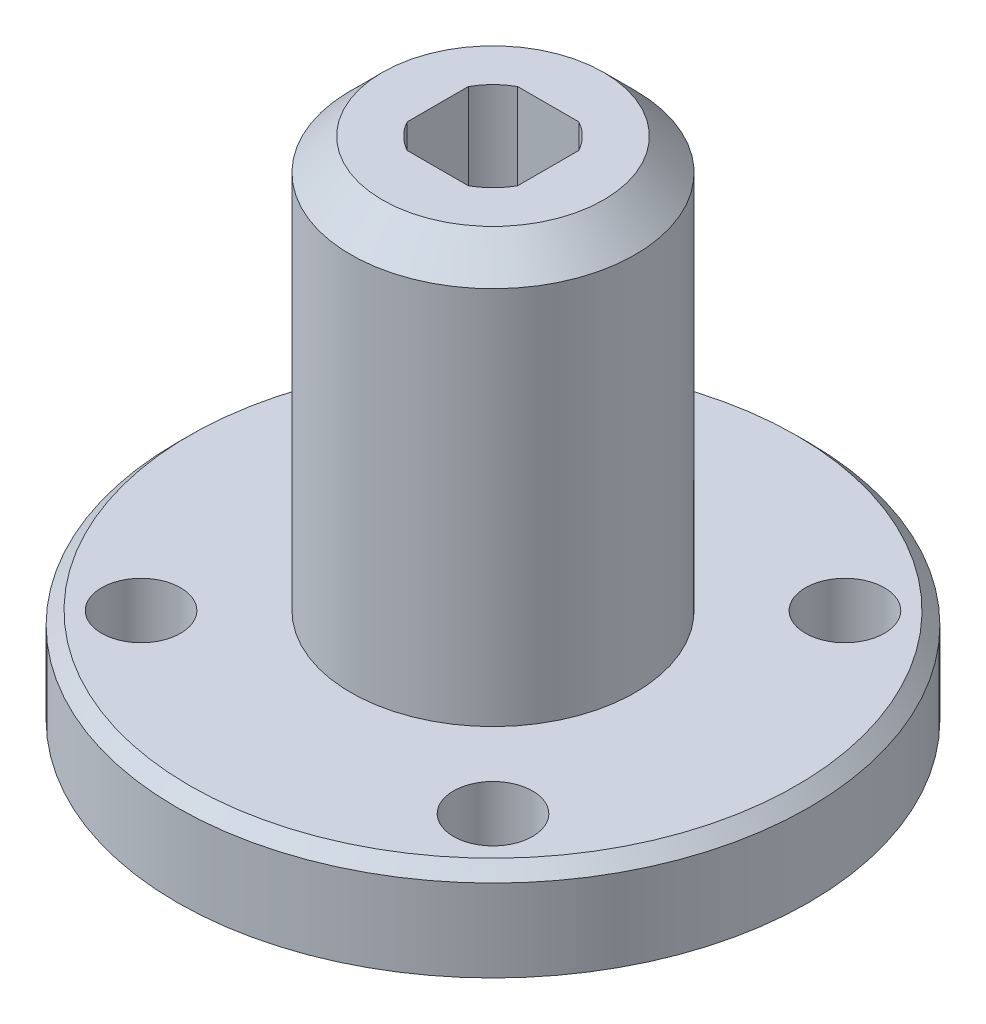
ISO-10303-21;
HEADER;
FILE_DESCRIPTION(('STEP AP214'),'2;1');
FILE_NAME('part.step','',(''),(''),'','','');
FILE_SCHEMA(('AUTOMOTIVE_DESIGN { 1 0 10303 214 1 1 1 1 }'));
ENDSEC;
DATA;
#1=APPLICATION_CONTEXT('core data for automotive mechanical design processes');
#2=APPLICATION_PROTOCOL_DEFINITION('international standard','automotive_design',2000,#1);
#3=PRODUCT_CONTEXT('',#1,'mechanical');
#4=PRODUCT('Part','Part','',(#3));
#5=PRODUCT_RELATED_PRODUCT_CATEGORY('part','',(#4));
#6=PRODUCT_DEFINITION_FORMATION('','',#4);
#7=PRODUCT_DEFINITION_CONTEXT('part definition',#1,'design');
#8=PRODUCT_DEFINITION('design','',#6,#7);
#9=PRODUCT_DEFINITION_SHAPE('','',#8);
#10=(LENGTH_UNIT() NAMED_UNIT(*) SI_UNIT(.MILLI.,.METRE.));
#11=(NAMED_UNIT(*) PLANE_ANGLE_UNIT() SI_UNIT($,.RADIAN.));
#12=(NAMED_UNIT(*) SI_UNIT($,.STERADIAN.) SOLID_ANGLE_UNIT());
#13=UNCERTAINTY_MEASURE_WITH_UNIT(LENGTH_MEASURE(1.E-05),#10,'distance_accuracy_value','');
#14=(GEOMETRIC_REPRESENTATION_CONTEXT(3) GLOBAL_UNCERTAINTY_ASSIGNED_CONTEXT((#13)) GLOBAL_UNIT_ASSIGNED_CONTEXT((#10,
#11,#12)) REPRESENTATION_CONTEXT('',''));
#15=CARTESIAN_POINT('',(0.,0.,0.));
#16=DIRECTION('',(0.,0.,1.));
#17=DIRECTION('',(1.,0.,0.));
#18=AXIS2_PLACEMENT_3D('',#15,#16,#17);
#19=CARTESIAN_POINT('',(0.,6.,0.));
#20=DIRECTION('',(0.,1.,0.));
#21=DIRECTION('',(0.,0.,1.));
#22=AXIS2_PLACEMENT_3D('',#19,#20,#21);
#23=PLANE('',#22);
#24=CARTESIAN_POINT('',(0.,6.,0.));
#25=DIRECTION('',(0.,1.,0.));
#26=DIRECTION('',(0.,0.,1.));
#27=AXIS2_PLACEMENT_3D('',#24,#25,#26);
#28=CIRCLE('',#27,19.2);
#29=CARTESIAN_POINT('',(0.,6.,19.2));
#30=VERTEX_POINT('',#29);
#31=EDGE_CURVE('E192',#30,#30,#28,.T.);
#32=ORIENTED_EDGE('',*,*,#31,.T.);
#33=EDGE_LOOP('',(#32));
#34=FACE_BOUND('',#33,.T.);
#35=CARTESIAN_POINT('',(-11.1369318036877,6.,11.1369318036886));
#36=DIRECTION('',(0.,1.,0.));
#37=DIRECTION('',(0.,0.,1.));
#38=AXIS2_PLACEMENT_3D('',#35,#36,#37);
#39=CIRCLE('',#38,2.5);
#40=CARTESIAN_POINT('',(-11.1369318036877,6.,13.6369318036886));
#41=VERTEX_POINT('',#40);
#42=EDGE_CURVE('E166',#41,#41,#39,.T.);
#43=ORIENTED_EDGE('',*,*,#42,.F.);
#44=EDGE_LOOP('',(#43));
#45=FACE_BOUND('',#44,.T.);
#46=CARTESIAN_POINT('',(11.1369318036885,6.,-11.1369318036886));
#47=DIRECTION('',(0.,1.,0.));
#48=DIRECTION('',(0.,0.,1.));
#49=AXIS2_PLACEMENT_3D('',#46,#47,#48);
#50=CIRCLE('',#49,2.5);
#51=CARTESIAN_POINT('',(11.1369318036885,6.,-8.63693180368857));
#52=VERTEX_POINT('',#51);
#53=EDGE_CURVE('E178',#52,#52,#50,.T.);
#54=ORIENTED_EDGE('',*,*,#53,.F.);
#55=EDGE_LOOP('',(#54));
#56=FACE_BOUND('',#55,.T.);
#57=CARTESIAN_POINT('',(-11.1369318036881,6.,-11.1369318036881));
#58=DIRECTION('',(0.,1.,0.));
#59=DIRECTION('',(0.,0.,1.));
#60=AXIS2_PLACEMENT_3D('',#57,#58,#59);
#61=CIRCLE('',#60,2.5);
#62=CARTESIAN_POINT('',(-11.1369318036881,6.,-8.63693180368811));
#63=VERTEX_POINT('',#62);
#64=EDGE_CURVE('E184',#63,#63,#61,.T.);
#65=ORIENTED_EDGE('',*,*,#64,.F.);
#66=EDGE_LOOP('',(#65));
#67=FACE_BOUND('',#66,.T.);
#68=CARTESIAN_POINT('',(11.136931803689,6.,11.1369318036881));
#69=DIRECTION('',(0.,1.,0.));
#70=DIRECTION('',(0.,0.,1.));
#71=AXIS2_PLACEMENT_3D('',#68,#69,#70);
#72=CIRCLE('',#71,2.5);
#73=CARTESIAN_POINT('',(11.136931803689,6.,13.6369318036881));
#74=VERTEX_POINT('',#73);
#75=EDGE_CURVE('E172',#74,#74,#72,.T.);
#76=ORIENTED_EDGE('',*,*,#75,.F.);
#77=EDGE_LOOP('',(#76));
#78=FACE_BOUND('',#77,.T.);
#79=CARTESIAN_POINT('',(0.,6.,0.));
#80=DIRECTION('',(0.,1.,0.));
#81=DIRECTION('',(0.,0.,1.));
#82=AXIS2_PLACEMENT_3D('',#79,#80,#81);
#83=CIRCLE('',#82,9.);
#84=CARTESIAN_POINT('',(0.,6.,-9.));
#85=VERTEX_POINT('',#84);
#86=EDGE_CURVE('E112',#85,#85,#83,.T.);
#87=ORIENTED_EDGE('',*,*,#86,.F.);
#88=EDGE_LOOP('',(#87));
#89=FACE_BOUND('',#88,.T.);
#90=ADVANCED_FACE('F33',(#34,#45,#56,#67,#78,#89),#23,.T.);
#91=CARTESIAN_POINT('',(0.,0.,0.));
#92=DIRECTION('',(0.,1.,0.));
#93=DIRECTION('',(0.,0.,1.));
#94=AXIS2_PLACEMENT_3D('',#91,#92,#93);
#95=PLANE('',#94);
#96=CARTESIAN_POINT('',(0.,0.,0.));
#97=DIRECTION('',(0.,1.,0.));
#98=DIRECTION('',(0.,0.,1.));
#99=AXIS2_PLACEMENT_3D('',#96,#97,#98);
#100=CIRCLE('',#99,20.);
#101=CARTESIAN_POINT('',(0.,0.,20.));
#102=VERTEX_POINT('',#101);
#103=EDGE_CURVE('E187',#102,#102,#100,.T.);
#104=ORIENTED_EDGE('',*,*,#103,.F.);
#105=EDGE_LOOP('',(#104));
#106=FACE_BOUND('',#105,.T.);
#107=CARTESIAN_POINT('',(-11.1369318036881,0.,-11.1369318036881));
#108=DIRECTION('',(0.,1.,0.));
#109=DIRECTION('',(0.,0.,1.));
#110=AXIS2_PLACEMENT_3D('',#107,#108,#109);
#111=CIRCLE('',#110,2.5);
#112=CARTESIAN_POINT('',(-11.1369318036881,0.,-8.63693180368811));
#113=VERTEX_POINT('',#112);
#114=EDGE_CURVE('E181',#113,#113,#111,.T.);
#115=ORIENTED_EDGE('',*,*,#114,.T.);
#116=EDGE_LOOP('',(#115));
#117=FACE_BOUND('',#116,.T.);
#118=CARTESIAN_POINT('',(11.1369318036885,0.,-11.1369318036886));
#119=DIRECTION('',(0.,1.,0.));
#120=DIRECTION('',(0.,0.,1.));
#121=AXIS2_PLACEMENT_3D('',#118,#119,#120);
#122=CIRCLE('',#121,2.5);
#123=CARTESIAN_POINT('',(11.1369318036885,0.,-8.63693180368857));
#124=VERTEX_POINT('',#123);
#125=EDGE_CURVE('E175',#124,#124,#122,.T.);
#126=ORIENTED_EDGE('',*,*,#125,.T.);
#127=EDGE_LOOP('',(#126));
#128=FACE_BOUND('',#127,.T.);
#129=CARTESIAN_POINT('',(11.136931803689,0.,11.1369318036881));
#130=DIRECTION('',(0.,1.,0.));
#131=DIRECTION('',(0.,0.,1.));
#132=AXIS2_PLACEMENT_3D('',#129,#130,#131);
#133=CIRCLE('',#132,2.5);
#134=CARTESIAN_POINT('',(11.136931803689,0.,13.6369318036881));
#135=VERTEX_POINT('',#134);
#136=EDGE_CURVE('E169',#135,#135,#133,.T.);
#137=ORIENTED_EDGE('',*,*,#136,.T.);
#138=EDGE_LOOP('',(#137));
#139=FACE_BOUND('',#138,.T.);
#140=CARTESIAN_POINT('',(-11.1369318036877,0.,11.1369318036886));
#141=DIRECTION('',(0.,1.,0.));
#142=DIRECTION('',(0.,0.,1.));
#143=AXIS2_PLACEMENT_3D('',#140,#141,#142);
#144=CIRCLE('',#143,2.5);
#145=CARTESIAN_POINT('',(-11.1369318036877,0.,13.6369318036886));
#146=VERTEX_POINT('',#145);
#147=EDGE_CURVE('E165',#146,#146,#144,.T.);
#148=ORIENTED_EDGE('',*,*,#147,.T.);
#149=EDGE_LOOP('',(#148));
#150=FACE_BOUND('',#149,.T.);
#151=ADVANCED_FACE('F211',(#106,#117,#128,#139,#150),#95,.F.);
#152=CARTESIAN_POINT('',(0.,6.,0.));
#153=DIRECTION('',(0.,-1.,0.));
#154=DIRECTION('',(0.,0.,-1.));
#155=AXIS2_PLACEMENT_3D('',#152,#153,#154);
#156=CYLINDRICAL_SURFACE('',#155,20.);
#157=CARTESIAN_POINT('',(0.,5.19999999999999,0.));
#158=DIRECTION('',(0.,1.,0.));
#159=DIRECTION('',(0.,0.,1.));
#160=AXIS2_PLACEMENT_3D('',#157,#158,#159);
#161=CIRCLE('',#160,20.);
#162=CARTESIAN_POINT('',(0.,5.19999999999999,20.));
#163=VERTEX_POINT('',#162);
#164=EDGE_CURVE('E195',#163,#163,#161,.F.);
#165=ORIENTED_EDGE('',*,*,#164,.T.);
#166=EDGE_LOOP('',(#165));
#167=FACE_BOUND('',#166,.T.);
#168=ORIENTED_EDGE('',*,*,#103,.T.);
#169=EDGE_LOOP('',(#168));
#170=FACE_BOUND('',#169,.T.);
#171=ADVANCED_FACE('F217',(#167,#170),#156,.T.);
#172=CARTESIAN_POINT('',(-11.1369318036881,6.,-11.1369318036881));
#173=DIRECTION('',(0.,-1.,0.));
#174=DIRECTION('',(0.,0.,-1.));
#175=AXIS2_PLACEMENT_3D('',#172,#173,#174);
#176=CYLINDRICAL_SURFACE('',#175,2.5);
#177=ORIENTED_EDGE('',*,*,#64,.T.);
#178=EDGE_LOOP('',(#177));
#179=FACE_BOUND('',#178,.T.);
#180=ORIENTED_EDGE('',*,*,#114,.F.);
#181=EDGE_LOOP('',(#180));
#182=FACE_BOUND('',#181,.T.);
#183=ADVANCED_FACE('F273',(#179,#182),#176,.F.);
#184=CARTESIAN_POINT('',(11.1369318036885,6.,-11.1369318036886));
#185=DIRECTION('',(0.,-1.,0.));
#186=DIRECTION('',(0.,0.,-1.));
#187=AXIS2_PLACEMENT_3D('',#184,#185,#186);
#188=CYLINDRICAL_SURFACE('',#187,2.5);
#189=ORIENTED_EDGE('',*,*,#53,.T.);
#190=EDGE_LOOP('',(#189));
#191=FACE_BOUND('',#190,.T.);
#192=ORIENTED_EDGE('',*,*,#125,.F.);
#193=EDGE_LOOP('',(#192));
#194=FACE_BOUND('',#193,.T.);
#195=ADVANCED_FACE('F270',(#191,#194),#188,.F.);
#196=CARTESIAN_POINT('',(11.136931803689,6.,11.1369318036881));
#197=DIRECTION('',(0.,-1.,0.));
#198=DIRECTION('',(0.,0.,-1.));
#199=AXIS2_PLACEMENT_3D('',#196,#197,#198);
#200=CYLINDRICAL_SURFACE('',#199,2.5);
#201=ORIENTED_EDGE('',*,*,#75,.T.);
#202=EDGE_LOOP('',(#201));
#203=FACE_BOUND('',#202,.T.);
#204=ORIENTED_EDGE('',*,*,#136,.F.);
#205=EDGE_LOOP('',(#204));
#206=FACE_BOUND('',#205,.T.);
#207=ADVANCED_FACE('F266',(#203,#206),#200,.F.);
#208=CARTESIAN_POINT('',(-11.1369318036877,6.,11.1369318036886));
#209=DIRECTION('',(0.,-1.,0.));
#210=DIRECTION('',(0.,0.,-1.));
#211=AXIS2_PLACEMENT_3D('',#208,#209,#210);
#212=CYLINDRICAL_SURFACE('',#211,2.5);
#213=ORIENTED_EDGE('',*,*,#42,.T.);
#214=EDGE_LOOP('',(#213));
#215=FACE_BOUND('',#214,.T.);
#216=ORIENTED_EDGE('',*,*,#147,.F.);
#217=EDGE_LOOP('',(#216));
#218=FACE_BOUND('',#217,.T.);
#219=ADVANCED_FACE('F260',(#215,#218),#212,.F.);
#220=CARTESIAN_POINT('',(0.,32.,0.));
#221=DIRECTION('',(0.,1.,0.));
#222=DIRECTION('',(0.,0.,1.));
#223=AXIS2_PLACEMENT_3D('',#220,#221,#222);
#224=PLANE('',#223);
#225=CARTESIAN_POINT('',(0.,32.,0.));
#226=DIRECTION('',(0.,1.,0.));
#227=DIRECTION('',(0.,0.,1.));
#228=AXIS2_PLACEMENT_3D('',#225,#226,#227);
#229=CIRCLE('',#228,7.00000000000003);
#230=CARTESIAN_POINT('',(0.,32.,7.00000000000003));
#231=VERTEX_POINT('',#230);
#232=EDGE_CURVE('E41',#231,#231,#229,.T.);
#233=ORIENTED_EDGE('',*,*,#232,.T.);
#234=EDGE_LOOP('',(#233));
#235=FACE_BOUND('',#234,.T.);
#236=DIRECTION('',(0.,0.,1.));
#237=VECTOR('',#236,1.);
#238=CARTESIAN_POINT('',(-3.5,32.,-1.93649167310371));
#239=LINE('',#238,#237);
#240=CARTESIAN_POINT('',(-3.5,32.,-1.93649167310371));
#241=VERTEX_POINT('',#240);
#242=CARTESIAN_POINT('',(-3.5,32.,1.93649167310371));
#243=VERTEX_POINT('',#242);
#244=EDGE_CURVE('E106',#241,#243,#239,.T.);
#245=ORIENTED_EDGE('',*,*,#244,.F.);
#246=CARTESIAN_POINT('',(0.,32.,0.));
#247=DIRECTION('',(0.,1.,0.));
#248=DIRECTION('',(0.,0.,1.));
#249=AXIS2_PLACEMENT_3D('',#246,#247,#248);
#250=CIRCLE('',#249,4.);
#251=CARTESIAN_POINT('',(-1.93649167310371,32.,-3.5));
#252=VERTEX_POINT('',#251);
#253=EDGE_CURVE('E97',#252,#241,#250,.T.);
#254=ORIENTED_EDGE('',*,*,#253,.F.);
#255=DIRECTION('',(-1.,0.,0.));
#256=VECTOR('',#255,1.);
#257=CARTESIAN_POINT('',(1.93649167310371,32.,-3.5));
#258=LINE('',#257,#256);
#259=CARTESIAN_POINT('',(1.93649167310371,32.,-3.5));
#260=VERTEX_POINT('',#259);
#261=EDGE_CURVE('E131',#260,#252,#258,.T.);
#262=ORIENTED_EDGE('',*,*,#261,.F.);
#263=CARTESIAN_POINT('',(0.,32.,0.));
#264=DIRECTION('',(0.,1.,0.));
#265=DIRECTION('',(0.,0.,1.));
#266=AXIS2_PLACEMENT_3D('',#263,#264,#265);
#267=CIRCLE('',#266,4.);
#268=CARTESIAN_POINT('',(3.5,32.,-1.93649167310371));
#269=VERTEX_POINT('',#268);
#270=EDGE_CURVE('E128',#269,#260,#267,.T.);
#271=ORIENTED_EDGE('',*,*,#270,.F.);
#272=DIRECTION('',(0.,0.,-1.));
#273=VECTOR('',#272,1.);
#274=CARTESIAN_POINT('',(3.5,32.,-1.93649167310371));
#275=LINE('',#274,#273);
#276=CARTESIAN_POINT('',(3.5,32.,1.93649167310371));
#277=VERTEX_POINT('',#276);
#278=EDGE_CURVE('E126',#277,#269,#275,.T.);
#279=ORIENTED_EDGE('',*,*,#278,.F.);
#280=CARTESIAN_POINT('',(0.,32.,0.));
#281=DIRECTION('',(0.,1.,0.));
#282=DIRECTION('',(0.,0.,1.));
#283=AXIS2_PLACEMENT_3D('',#280,#281,#282);
#284=CIRCLE('',#283,4.);
#285=CARTESIAN_POINT('',(1.93649167310371,32.,3.5));
#286=VERTEX_POINT('',#285);
#287=EDGE_CURVE('E124',#286,#277,#284,.T.);
#288=ORIENTED_EDGE('',*,*,#287,.F.);
#289=DIRECTION('',(1.,0.,0.));
#290=VECTOR('',#289,1.);
#291=CARTESIAN_POINT('',(1.93649167310371,32.,3.5));
#292=LINE('',#291,#290);
#293=CARTESIAN_POINT('',(-1.93649167310371,32.,3.5));
#294=VERTEX_POINT('',#293);
#295=EDGE_CURVE('E120',#294,#286,#292,.T.);
#296=ORIENTED_EDGE('',*,*,#295,.F.);
#297=CARTESIAN_POINT('',(0.,32.,0.));
#298=DIRECTION('',(0.,1.,0.));
#299=DIRECTION('',(0.,0.,1.));
#300=AXIS2_PLACEMENT_3D('',#297,#298,#299);
#301=CIRCLE('',#300,4.);
#302=EDGE_CURVE('E118',#243,#294,#301,.T.);
#303=ORIENTED_EDGE('',*,*,#302,.F.);
#304=EDGE_LOOP('',(#245,#254,#262,#271,#279,#288,#296,#303));
#305=FACE_BOUND('',#304,.T.);
#306=ADVANCED_FACE('F116',(#235,#305),#224,.T.);
#307=CARTESIAN_POINT('',(0.,32.,0.));
#308=DIRECTION('',(0.,-1.,0.));
#309=DIRECTION('',(0.,0.,-1.));
#310=AXIS2_PLACEMENT_3D('',#307,#308,#309);
#311=CYLINDRICAL_SURFACE('',#310,9.);
#312=CARTESIAN_POINT('',(0.,30.,0.));
#313=DIRECTION('',(0.,1.,0.));
#314=DIRECTION('',(0.,0.,1.));
#315=AXIS2_PLACEMENT_3D('',#312,#313,#314);
#316=CIRCLE('',#315,9.);
#317=CARTESIAN_POINT('',(0.,30.,-9.));
#318=VERTEX_POINT('',#317);
#319=EDGE_CURVE('E11',#318,#318,#316,.F.);
#320=CARTESIAN_POINT('',(0.,30.,-9.));
#321=CARTESIAN_POINT('',(0.,29.75,-9.));
#322=CARTESIAN_POINT('',(0.,29.5,-9.));
#323=CARTESIAN_POINT('',(0.,29.,-9.));
#324=CARTESIAN_POINT('',(0.,28.75,-9.));
#325=CARTESIAN_POINT('',(0.,28.25,-9.));
#326=CARTESIAN_POINT('',(0.,28.,-9.));
#327=CARTESIAN_POINT('',(0.,27.5,-9.));
#328=CARTESIAN_POINT('',(0.,27.25,-9.));
#329=CARTESIAN_POINT('',(0.,26.75,-9.));
#330=CARTESIAN_POINT('',(0.,26.5,-9.));
#331=CARTESIAN_POINT('',(0.,26.,-9.));
#332=CARTESIAN_POINT('',(0.,25.75,-9.));
#333=CARTESIAN_POINT('',(0.,25.25,-9.));
#334=CARTESIAN_POINT('',(0.,25.,-9.));
#335=CARTESIAN_POINT('',(0.,24.5,-9.));
#336=CARTESIAN_POINT('',(0.,24.25,-9.));
#337=CARTESIAN_POINT('',(0.,23.75,-9.));
#338=CARTESIAN_POINT('',(0.,23.5,-9.));
#339=CARTESIAN_POINT('',(0.,23.,-9.));
#340=CARTESIAN_POINT('',(0.,22.75,-9.));
#341=CARTESIAN_POINT('',(0.,22.25,-9.));
#342=CARTESIAN_POINT('',(0.,22.,-9.));
#343=CARTESIAN_POINT('',(0.,21.5,-9.));
#344=CARTESIAN_POINT('',(0.,21.25,-9.));
#345=CARTESIAN_POINT('',(0.,20.75,-9.));
#346=CARTESIAN_POINT('',(0.,20.5,-9.));
#347=CARTESIAN_POINT('',(0.,20.,-9.));
#348=CARTESIAN_POINT('',(0.,19.75,-9.));
#349=CARTESIAN_POINT('',(0.,19.25,-9.));
#350=CARTESIAN_POINT('',(0.,19.,-9.));
#351=CARTESIAN_POINT('',(0.,18.5,-9.));
#352=CARTESIAN_POINT('',(0.,18.25,-9.));
#353=CARTESIAN_POINT('',(0.,17.75,-9.));
#354=CARTESIAN_POINT('',(0.,17.5,-9.));
#355=CARTESIAN_POINT('',(0.,17.,-9.));
#356=CARTESIAN_POINT('',(0.,16.75,-9.));
#357=CARTESIAN_POINT('',(0.,16.25,-9.));
#358=CARTESIAN_POINT('',(0.,16.,-9.));
#359=CARTESIAN_POINT('',(0.,15.5,-9.));
#360=CARTESIAN_POINT('',(0.,15.25,-9.));
#361=CARTESIAN_POINT('',(0.,14.75,-9.));
#362=CARTESIAN_POINT('',(0.,14.5,-9.));
#363=CARTESIAN_POINT('',(0.,14.,-9.));
#364=CARTESIAN_POINT('',(0.,13.75,-9.));
#365=CARTESIAN_POINT('',(0.,13.25,-9.));
#366=CARTESIAN_POINT('',(0.,13.,-9.));
#367=CARTESIAN_POINT('',(0.,12.5,-9.));
#368=CARTESIAN_POINT('',(0.,12.25,-9.));
#369=CARTESIAN_POINT('',(0.,11.75,-9.));
#370=CARTESIAN_POINT('',(0.,11.5,-9.));
#371=CARTESIAN_POINT('',(0.,11.,-9.));
#372=CARTESIAN_POINT('',(0.,10.75,-9.));
#373=CARTESIAN_POINT('',(0.,10.25,-9.));
#374=CARTESIAN_POINT('',(0.,10.,-9.));
#375=CARTESIAN_POINT('',(0.,9.50000000000001,-9.));
#376=CARTESIAN_POINT('',(0.,9.25000000000001,-9.));
#377=CARTESIAN_POINT('',(0.,8.75,-9.));
#378=CARTESIAN_POINT('',(0.,8.5,-9.));
#379=CARTESIAN_POINT('',(0.,8.,-9.));
#380=CARTESIAN_POINT('',(0.,7.75,-9.));
#381=CARTESIAN_POINT('',(0.,7.25,-9.));
#382=CARTESIAN_POINT('',(0.,7.,-9.));
#383=CARTESIAN_POINT('',(0.,6.5,-9.));
#384=CARTESIAN_POINT('',(0.,6.25,-9.));
#385=CARTESIAN_POINT('',(0.,6.,-9.));
#386=B_SPLINE_CURVE_WITH_KNOTS('',3,(#320,#321,#322,#323,#324,#325,#326,#327,#328,#329,#330,
#331,#332,#333,#334,#335,#336,#337,#338,#339,#340,#341,#342,#343,#344,#345,#346,#347,#348,#349,
#350,#351,#352,#353,#354,#355,#356,#357,#358,#359,#360,#361,#362,#363,#364,#365,#366,#367,#368,
#369,#370,#371,#372,#373,#374,#375,#376,#377,#378,#379,#380,#381,#382,#383,#384,#385),
.UNSPECIFIED.,.F.,.F.,(4,2,2,2,2,2,2,2,2,2,2,2,2,2,2,2,2,2,2,2,2,2,2,2,2,2,2,2,2,2,2,2,4),(0.,
0.750000000000001,1.5,2.25000000000001,3.00000000000001,3.75000000000001,4.50000000000001,
5.25000000000001,6.00000000000001,6.75000000000001,7.50000000000001,8.25000000000001,
9.00000000000001,9.75000000000001,10.5,11.25,12.,12.75,13.5,14.25,15.,15.75,16.5,17.25,18.,
18.75,19.5,20.25,21.,21.75,22.5,23.25,24.),.UNSPECIFIED.);
#387=EDGE_CURVE('BSEAM257',#318,#85,#386,.T.);
#388=ORIENTED_EDGE('',*,*,#319,.T.);
#389=ORIENTED_EDGE('',*,*,#86,.T.);
#390=ORIENTED_EDGE('',*,*,#387,.T.);
#391=ORIENTED_EDGE('',*,*,#387,.F.);
#392=EDGE_LOOP('',(#388,#390,#389,#391));
#393=FACE_BOUND('',#392,.T.);
#394=ADVANCED_FACE('F257',(#393),#311,.T.);
#395=CARTESIAN_POINT('',(0.,32.,0.));
#396=DIRECTION('',(0.,-1.,0.));
#397=DIRECTION('',(0.,0.,-1.));
#398=AXIS2_PLACEMENT_3D('',#395,#396,#397);
#399=CYLINDRICAL_SURFACE('',#398,4.);
#400=CARTESIAN_POINT('',(0.,6.,0.));
#401=DIRECTION('',(0.,1.,0.));
#402=DIRECTION('',(0.,0.,1.));
#403=AXIS2_PLACEMENT_3D('',#400,#401,#402);
#404=CIRCLE('',#403,4.);
#405=CARTESIAN_POINT('',(-1.93649167310371,6.,-3.5));
#406=VERTEX_POINT('',#405);
#407=CARTESIAN_POINT('',(-3.5,6.,-1.93649167310371));
#408=VERTEX_POINT('',#407);
#409=EDGE_CURVE('E48',#406,#408,#404,.T.);
#410=ORIENTED_EDGE('',*,*,#409,.F.);
#411=DIRECTION('',(0.,-1.,0.));
#412=VECTOR('',#411,1.);
#413=CARTESIAN_POINT('',(-1.93649167310371,32.,-3.5));
#414=LINE('',#413,#412);
#415=EDGE_CURVE('E102',#252,#406,#414,.T.);
#416=ORIENTED_EDGE('',*,*,#415,.F.);
#417=ORIENTED_EDGE('',*,*,#253,.T.);
#418=DIRECTION('',(0.,-1.,0.));
#419=VECTOR('',#418,1.);
#420=CARTESIAN_POINT('',(-3.5,32.,-1.93649167310371));
#421=LINE('',#420,#419);
#422=EDGE_CURVE('E100',#241,#408,#421,.T.);
#423=ORIENTED_EDGE('',*,*,#422,.T.);
#424=EDGE_LOOP('',(#410,#416,#417,#423));
#425=FACE_BOUND('',#424,.T.);
#426=ADVANCED_FACE('F99',(#425),#399,.F.);
#427=CARTESIAN_POINT('',(-3.5,32.,-1.93649167310371));
#428=DIRECTION('',(1.,0.,0.));
#429=DIRECTION('',(0.,0.,-1.));
#430=AXIS2_PLACEMENT_3D('',#427,#428,#429);
#431=PLANE('',#430);
#432=DIRECTION('',(0.,0.,1.));
#433=VECTOR('',#432,1.);
#434=CARTESIAN_POINT('',(-3.5,6.,-1.93649167310371));
#435=LINE('',#434,#433);
#436=CARTESIAN_POINT('',(-3.5,6.,1.93649167310371));
#437=VERTEX_POINT('',#436);
#438=EDGE_CURVE('E52',#408,#437,#435,.T.);
#439=ORIENTED_EDGE('',*,*,#438,.F.);
#440=ORIENTED_EDGE('',*,*,#422,.F.);
#441=ORIENTED_EDGE('',*,*,#244,.T.);
#442=DIRECTION('',(0.,-1.,0.));
#443=VECTOR('',#442,1.);
#444=CARTESIAN_POINT('',(-3.5,32.,1.93649167310371));
#445=LINE('',#444,#443);
#446=EDGE_CURVE('E113',#243,#437,#445,.T.);
#447=ORIENTED_EDGE('',*,*,#446,.T.);
#448=EDGE_LOOP('',(#439,#440,#441,#447));
#449=FACE_BOUND('',#448,.T.);
#450=ADVANCED_FACE('F110',(#449),#431,.T.);
#451=CARTESIAN_POINT('',(0.,32.,0.));
#452=DIRECTION('',(0.,-1.,0.));
#453=DIRECTION('',(0.,0.,-1.));
#454=AXIS2_PLACEMENT_3D('',#451,#452,#453);
#455=CYLINDRICAL_SURFACE('',#454,4.);
#456=CARTESIAN_POINT('',(0.,6.,0.));
#457=DIRECTION('',(0.,1.,0.));
#458=DIRECTION('',(0.,0.,1.));
#459=AXIS2_PLACEMENT_3D('',#456,#457,#458);
#460=CIRCLE('',#459,4.);
#461=CARTESIAN_POINT('',(-1.93649167310371,6.,3.5));
#462=VERTEX_POINT('',#461);
#463=EDGE_CURVE('E135',#437,#462,#460,.T.);
#464=ORIENTED_EDGE('',*,*,#463,.F.);
#465=ORIENTED_EDGE('',*,*,#446,.F.);
#466=ORIENTED_EDGE('',*,*,#302,.T.);
#467=DIRECTION('',(0.,-1.,0.));
#468=VECTOR('',#467,1.);
#469=CARTESIAN_POINT('',(-1.93649167310371,32.,3.5));
#470=LINE('',#469,#468);
#471=EDGE_CURVE('E159',#294,#462,#470,.T.);
#472=ORIENTED_EDGE('',*,*,#471,.T.);
#473=EDGE_LOOP('',(#464,#465,#466,#472));
#474=FACE_BOUND('',#473,.T.);
#475=ADVANCED_FACE('F248',(#474),#455,.F.);
#476=CARTESIAN_POINT('',(1.93649167310371,32.,3.5));
#477=DIRECTION('',(0.,0.,-1.));
#478=DIRECTION('',(-1.,0.,0.));
#479=AXIS2_PLACEMENT_3D('',#476,#477,#478);
#480=PLANE('',#479);
#481=DIRECTION('',(1.,0.,0.));
#482=VECTOR('',#481,1.);
#483=CARTESIAN_POINT('',(1.93649167310371,6.,3.5));
#484=LINE('',#483,#482);
#485=CARTESIAN_POINT('',(1.93649167310371,6.,3.5));
#486=VERTEX_POINT('',#485);
#487=EDGE_CURVE('E137',#462,#486,#484,.T.);
#488=ORIENTED_EDGE('',*,*,#487,.F.);
#489=ORIENTED_EDGE('',*,*,#471,.F.);
#490=ORIENTED_EDGE('',*,*,#295,.T.);
#491=DIRECTION('',(0.,-1.,0.));
#492=VECTOR('',#491,1.);
#493=CARTESIAN_POINT('',(1.93649167310371,32.,3.5));
#494=LINE('',#493,#492);
#495=EDGE_CURVE('E156',#286,#486,#494,.T.);
#496=ORIENTED_EDGE('',*,*,#495,.T.);
#497=EDGE_LOOP('',(#488,#489,#490,#496));
#498=FACE_BOUND('',#497,.T.);
#499=ADVANCED_FACE('F244',(#498),#480,.T.);
#500=CARTESIAN_POINT('',(0.,32.,0.));
#501=DIRECTION('',(0.,-1.,0.));
#502=DIRECTION('',(0.,0.,-1.));
#503=AXIS2_PLACEMENT_3D('',#500,#501,#502);
#504=CYLINDRICAL_SURFACE('',#503,4.);
#505=CARTESIAN_POINT('',(0.,6.,0.));
#506=DIRECTION('',(0.,1.,0.));
#507=DIRECTION('',(0.,0.,1.));
#508=AXIS2_PLACEMENT_3D('',#505,#506,#507);
#509=CIRCLE('',#508,4.);
#510=CARTESIAN_POINT('',(3.5,6.,1.93649167310371));
#511=VERTEX_POINT('',#510);
#512=EDGE_CURVE('E139',#486,#511,#509,.T.);
#513=ORIENTED_EDGE('',*,*,#512,.F.);
#514=ORIENTED_EDGE('',*,*,#495,.F.);
#515=ORIENTED_EDGE('',*,*,#287,.T.);
#516=DIRECTION('',(0.,-1.,0.));
#517=VECTOR('',#516,1.);
#518=CARTESIAN_POINT('',(3.5,32.,1.93649167310371));
#519=LINE('',#518,#517);
#520=EDGE_CURVE('E153',#277,#511,#519,.T.);
#521=ORIENTED_EDGE('',*,*,#520,.T.);
#522=EDGE_LOOP('',(#513,#514,#515,#521));
#523=FACE_BOUND('',#522,.T.);
#524=ADVANCED_FACE('F240',(#523),#504,.F.);
#525=CARTESIAN_POINT('',(3.5,32.,-1.93649167310371));
#526=DIRECTION('',(-1.,0.,0.));
#527=DIRECTION('',(0.,0.,1.));
#528=AXIS2_PLACEMENT_3D('',#525,#526,#527);
#529=PLANE('',#528);
#530=DIRECTION('',(0.,0.,-1.));
#531=VECTOR('',#530,1.);
#532=CARTESIAN_POINT('',(3.5,6.,-1.93649167310371));
#533=LINE('',#532,#531);
#534=CARTESIAN_POINT('',(3.5,6.,-1.93649167310371));
#535=VERTEX_POINT('',#534);
#536=EDGE_CURVE('E141',#511,#535,#533,.T.);
#537=ORIENTED_EDGE('',*,*,#536,.F.);
#538=ORIENTED_EDGE('',*,*,#520,.F.);
#539=ORIENTED_EDGE('',*,*,#278,.T.);
#540=DIRECTION('',(0.,-1.,0.));
#541=VECTOR('',#540,1.);
#542=CARTESIAN_POINT('',(3.5,32.,-1.93649167310371));
#543=LINE('',#542,#541);
#544=EDGE_CURVE('E150',#269,#535,#543,.T.);
#545=ORIENTED_EDGE('',*,*,#544,.T.);
#546=EDGE_LOOP('',(#537,#538,#539,#545));
#547=FACE_BOUND('',#546,.T.);
#548=ADVANCED_FACE('F233',(#547),#529,.T.);
#549=CARTESIAN_POINT('',(0.,32.,0.));
#550=DIRECTION('',(0.,-1.,0.));
#551=DIRECTION('',(0.,0.,-1.));
#552=AXIS2_PLACEMENT_3D('',#549,#550,#551);
#553=CYLINDRICAL_SURFACE('',#552,4.);
#554=CARTESIAN_POINT('',(0.,6.,0.));
#555=DIRECTION('',(0.,1.,0.));
#556=DIRECTION('',(0.,0.,1.));
#557=AXIS2_PLACEMENT_3D('',#554,#555,#556);
#558=CIRCLE('',#557,4.);
#559=CARTESIAN_POINT('',(1.93649167310371,6.,-3.5));
#560=VERTEX_POINT('',#559);
#561=EDGE_CURVE('E143',#535,#560,#558,.T.);
#562=ORIENTED_EDGE('',*,*,#561,.F.);
#563=ORIENTED_EDGE('',*,*,#544,.F.);
#564=ORIENTED_EDGE('',*,*,#270,.T.);
#565=DIRECTION('',(0.,-1.,0.));
#566=VECTOR('',#565,1.);
#567=CARTESIAN_POINT('',(1.93649167310371,32.,-3.5));
#568=LINE('',#567,#566);
#569=EDGE_CURVE('E147',#260,#560,#568,.T.);
#570=ORIENTED_EDGE('',*,*,#569,.T.);
#571=EDGE_LOOP('',(#562,#563,#564,#570));
#572=FACE_BOUND('',#571,.T.);
#573=ADVANCED_FACE('F227',(#572),#553,.F.);
#574=CARTESIAN_POINT('',(1.93649167310371,32.,-3.5));
#575=DIRECTION('',(0.,0.,1.));
#576=DIRECTION('',(1.,0.,0.));
#577=AXIS2_PLACEMENT_3D('',#574,#575,#576);
#578=PLANE('',#577);
#579=DIRECTION('',(-1.,0.,0.));
#580=VECTOR('',#579,1.);
#581=CARTESIAN_POINT('',(1.93649167310371,6.,-3.5));
#582=LINE('',#581,#580);
#583=EDGE_CURVE('E107',#560,#406,#582,.T.);
#584=ORIENTED_EDGE('',*,*,#583,.F.);
#585=ORIENTED_EDGE('',*,*,#569,.F.);
#586=ORIENTED_EDGE('',*,*,#261,.T.);
#587=ORIENTED_EDGE('',*,*,#415,.T.);
#588=EDGE_LOOP('',(#584,#585,#586,#587));
#589=FACE_BOUND('',#588,.T.);
#590=ADVANCED_FACE('F223',(#589),#578,.T.);
#591=ORIENTED_EDGE('',*,*,#409,.T.);
#592=ORIENTED_EDGE('',*,*,#438,.T.);
#593=ORIENTED_EDGE('',*,*,#463,.T.);
#594=ORIENTED_EDGE('',*,*,#487,.T.);
#595=ORIENTED_EDGE('',*,*,#512,.T.);
#596=ORIENTED_EDGE('',*,*,#536,.T.);
#597=ORIENTED_EDGE('',*,*,#561,.T.);
#598=ORIENTED_EDGE('',*,*,#583,.T.);
#599=EDGE_LOOP('',(#591,#592,#593,#594,#595,#596,#597,#598));
#600=FACE_BOUND('',#599,.T.);
#601=ADVANCED_FACE('F207',(#600),#23,.T.);
#602=CARTESIAN_POINT('',(0.,6.,0.));
#603=DIRECTION('',(0.,-1.,0.));
#604=DIRECTION('',(0.,0.,-1.));
#605=AXIS2_PLACEMENT_3D('',#602,#603,#604);
#606=CONICAL_SURFACE('',#605,19.2,0.785398163397442);
#607=ORIENTED_EDGE('',*,*,#164,.F.);
#608=EDGE_LOOP('',(#607));
#609=FACE_BOUND('',#608,.T.);
#610=ORIENTED_EDGE('',*,*,#31,.F.);
#611=EDGE_LOOP('',(#610));
#612=FACE_BOUND('',#611,.T.);
#613=ADVANCED_FACE('F202',(#609,#612),#606,.T.);
#614=CARTESIAN_POINT('',(0.,32.,0.));
#615=DIRECTION('',(0.,-1.,0.));
#616=DIRECTION('',(0.,0.,-1.));
#617=AXIS2_PLACEMENT_3D('',#614,#615,#616);
#618=CONICAL_SURFACE('',#617,7.00000000000003,0.785398163397447);
#619=ORIENTED_EDGE('',*,*,#319,.F.);
#620=EDGE_LOOP('',(#619));
#621=FACE_BOUND('',#620,.T.);
#622=ORIENTED_EDGE('',*,*,#232,.F.);
#623=EDGE_LOOP('',(#622));
#624=FACE_BOUND('',#623,.T.);
#625=ADVANCED_FACE('F35',(#621,#624),#618,.T.);
#626=CLOSED_SHELL('',(#90,#151,#171,#183,#195,#207,#219,#306,#394,#426,#450,#475,#499,#524,#548,
#573,#590,#601,#613,#625));
#627=MANIFOLD_SOLID_BREP('B2',#626);
#628=ADVANCED_BREP_SHAPE_REPRESENTATION('',(#18,#627),#14);
#629=SHAPE_DEFINITION_REPRESENTATION(#9,#628);
ENDSEC;
END-ISO-10303-21;
